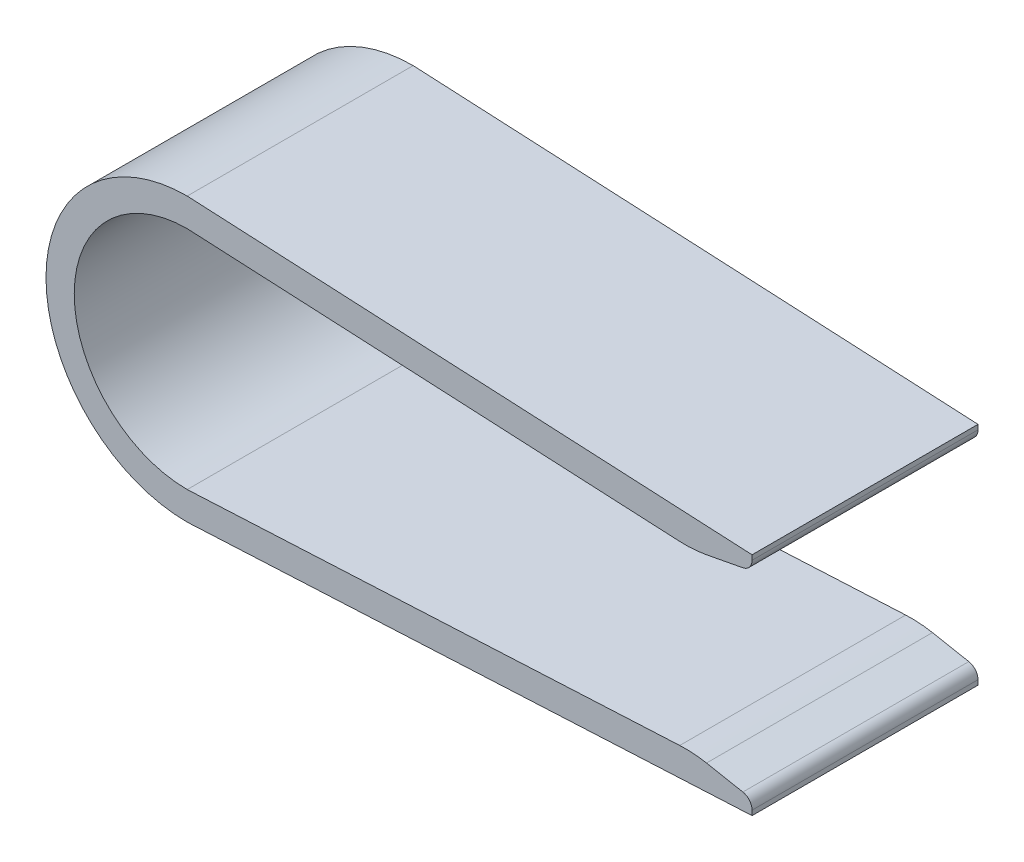
ISO-10303-21;
HEADER;
FILE_DESCRIPTION(('STEP AP214'),'2;1');
FILE_NAME('part.step','',(''),(''),'','','');
FILE_SCHEMA(('AUTOMOTIVE_DESIGN { 1 0 10303 214 1 1 1 1 }'));
ENDSEC;
DATA;
#1=APPLICATION_CONTEXT('core data for automotive mechanical design processes');
#2=APPLICATION_PROTOCOL_DEFINITION('international standard','automotive_design',2000,#1);
#3=PRODUCT_CONTEXT('',#1,'mechanical');
#4=PRODUCT('Part','Part','',(#3));
#5=PRODUCT_RELATED_PRODUCT_CATEGORY('part','',(#4));
#6=PRODUCT_DEFINITION_FORMATION('','',#4);
#7=PRODUCT_DEFINITION_CONTEXT('part definition',#1,'design');
#8=PRODUCT_DEFINITION('design','',#6,#7);
#9=PRODUCT_DEFINITION_SHAPE('','',#8);
#10=(LENGTH_UNIT() NAMED_UNIT(*) SI_UNIT(.MILLI.,.METRE.));
#11=(NAMED_UNIT(*) PLANE_ANGLE_UNIT() SI_UNIT($,.RADIAN.));
#12=(NAMED_UNIT(*) SI_UNIT($,.STERADIAN.) SOLID_ANGLE_UNIT());
#13=UNCERTAINTY_MEASURE_WITH_UNIT(LENGTH_MEASURE(1.E-05),#10,'distance_accuracy_value','');
#14=(GEOMETRIC_REPRESENTATION_CONTEXT(3) GLOBAL_UNCERTAINTY_ASSIGNED_CONTEXT((#13)) GLOBAL_UNIT_ASSIGNED_CONTEXT((#10,
#11,#12)) REPRESENTATION_CONTEXT('',''));
#15=CARTESIAN_POINT('',(0.,0.,0.));
#16=DIRECTION('',(0.,0.,1.));
#17=DIRECTION('',(1.,0.,0.));
#18=AXIS2_PLACEMENT_3D('',#15,#16,#17);
#19=CARTESIAN_POINT('',(50.,8.7500000000001,20.));
#20=DIRECTION('',(-0.186676395761627,0.982421459082327,0.));
#21=DIRECTION('',(-0.982421459082327,-0.186676395761627,0.));
#22=AXIS2_PLACEMENT_3D('',#19,#20,#21);
#23=PLANE('',#22);
#24=DIRECTION('',(0.982421459082327,0.186676395761627,0.));
#25=VECTOR('',#24,1.);
#26=CARTESIAN_POINT('',(50.,8.7500000000001,0.));
#27=LINE('',#26,#25);
#28=CARTESIAN_POINT('',(45.9653450918472,7.98334854971576,0.));
#29=VERTEX_POINT('',#28);
#30=CARTESIAN_POINT('',(49.1866763957616,8.59545500546294,0.));
#31=VERTEX_POINT('',#30);
#32=EDGE_CURVE('E175',#29,#31,#27,.T.);
#33=ORIENTED_EDGE('',*,*,#32,.T.);
#34=DIRECTION('',(0.,0.,-1.));
#35=VECTOR('',#34,1.);
#36=CARTESIAN_POINT('',(49.1866763957616,8.59545500546294,20.));
#37=LINE('',#36,#35);
#38=CARTESIAN_POINT('',(49.1866763957616,8.59545500546294,20.));
#39=VERTEX_POINT('',#38);
#40=EDGE_CURVE('E11',#31,#39,#37,.F.);
#41=ORIENTED_EDGE('',*,*,#40,.T.);
#42=DIRECTION('',(0.982421459082327,0.186676395761627,0.));
#43=VECTOR('',#42,1.);
#44=CARTESIAN_POINT('',(50.,8.7500000000001,20.));
#45=LINE('',#44,#43);
#46=CARTESIAN_POINT('',(45.9653450918472,7.98334854971576,20.));
#47=VERTEX_POINT('',#46);
#48=EDGE_CURVE('E141',#47,#39,#45,.T.);
#49=ORIENTED_EDGE('',*,*,#48,.F.);
#50=DIRECTION('',(0.,0.,-1.));
#51=VECTOR('',#50,1.);
#52=CARTESIAN_POINT('',(45.9653450918472,7.98334854971576,20.));
#53=LINE('',#52,#51);
#54=EDGE_CURVE('E222',#47,#29,#53,.T.);
#55=ORIENTED_EDGE('',*,*,#54,.T.);
#56=EDGE_LOOP('',(#33,#41,#49,#55));
#57=FACE_BOUND('',#56,.T.);
#58=ADVANCED_FACE('F33',(#57),#23,.F.);
#59=CARTESIAN_POINT('',(50.,10.,20.));
#60=DIRECTION('',(-1.,0.,0.));
#61=DIRECTION('',(0.,0.,1.));
#62=AXIS2_PLACEMENT_3D('',#59,#60,#61);
#63=PLANE('',#62);
#64=DIRECTION('',(0.,1.,0.));
#65=VECTOR('',#64,1.);
#66=CARTESIAN_POINT('',(50.,10.,20.));
#67=LINE('',#66,#65);
#68=CARTESIAN_POINT('',(50.,9.57787646454526,20.));
#69=VERTEX_POINT('',#68);
#70=CARTESIAN_POINT('',(50.,10.,20.));
#71=VERTEX_POINT('',#70);
#72=EDGE_CURVE('E131',#69,#71,#67,.T.);
#73=ORIENTED_EDGE('',*,*,#72,.F.);
#74=DIRECTION('',(0.,0.,-1.));
#75=VECTOR('',#74,1.);
#76=CARTESIAN_POINT('',(50.,9.57787646454526,20.));
#77=LINE('',#76,#75);
#78=CARTESIAN_POINT('',(50.,9.57787646454526,0.));
#79=VERTEX_POINT('',#78);
#80=EDGE_CURVE('E41',#69,#79,#77,.T.);
#81=ORIENTED_EDGE('',*,*,#80,.T.);
#82=DIRECTION('',(0.,1.,0.));
#83=VECTOR('',#82,1.);
#84=CARTESIAN_POINT('',(50.,10.,0.));
#85=LINE('',#84,#83);
#86=CARTESIAN_POINT('',(50.,10.,0.));
#87=VERTEX_POINT('',#86);
#88=EDGE_CURVE('E147',#79,#87,#85,.T.);
#89=ORIENTED_EDGE('',*,*,#88,.T.);
#90=DIRECTION('',(0.,0.,-1.));
#91=VECTOR('',#90,1.);
#92=CARTESIAN_POINT('',(50.,10.,20.));
#93=LINE('',#92,#91);
#94=EDGE_CURVE('E144',#71,#87,#93,.T.);
#95=ORIENTED_EDGE('',*,*,#94,.F.);
#96=EDGE_LOOP('',(#73,#81,#89,#95));
#97=FACE_BOUND('',#96,.T.);
#98=ADVANCED_FACE('F145',(#97),#63,.F.);
#99=CARTESIAN_POINT('',(0.,12.5,20.));
#100=DIRECTION('',(-0.0499376169438922,-0.998752338877845,0.));
#101=DIRECTION('',(0.998752338877845,-0.0499376169438923,0.));
#102=AXIS2_PLACEMENT_3D('',#99,#100,#101);
#103=PLANE('',#102);
#104=DIRECTION('',(-0.998752338877845,0.0499376169438922,0.));
#105=VECTOR('',#104,1.);
#106=CARTESIAN_POINT('',(0.,12.5,0.));
#107=LINE('',#106,#105);
#108=CARTESIAN_POINT('',(0.,12.5,0.));
#109=VERTEX_POINT('',#108);
#110=EDGE_CURVE('E178',#87,#109,#107,.T.);
#111=ORIENTED_EDGE('',*,*,#110,.T.);
#112=DIRECTION('',(0.,0.,-1.));
#113=VECTOR('',#112,1.);
#114=CARTESIAN_POINT('',(0.,12.5,20.));
#115=LINE('',#114,#113);
#116=CARTESIAN_POINT('',(0.,12.5,20.));
#117=VERTEX_POINT('',#116);
#118=EDGE_CURVE('E151',#117,#109,#115,.T.);
#119=ORIENTED_EDGE('',*,*,#118,.F.);
#120=DIRECTION('',(-0.998752338877845,0.0499376169438922,0.));
#121=VECTOR('',#120,1.);
#122=CARTESIAN_POINT('',(0.,12.5,20.));
#123=LINE('',#122,#121);
#124=EDGE_CURVE('E136',#71,#117,#123,.T.);
#125=ORIENTED_EDGE('',*,*,#124,.F.);
#126=ORIENTED_EDGE('',*,*,#94,.T.);
#127=EDGE_LOOP('',(#111,#119,#125,#126));
#128=FACE_BOUND('',#127,.T.);
#129=ADVANCED_FACE('F153',(#128),#103,.F.);
#130=CARTESIAN_POINT('',(0.,0.,20.));
#131=DIRECTION('',(0.,0.,-1.));
#132=DIRECTION('',(-1.,0.,0.));
#133=AXIS2_PLACEMENT_3D('',#130,#131,#132);
#134=CYLINDRICAL_SURFACE('',#133,12.5);
#135=CARTESIAN_POINT('',(0.,0.,0.));
#136=DIRECTION('',(0.,0.,1.));
#137=DIRECTION('',(1.,0.,0.));
#138=AXIS2_PLACEMENT_3D('',#135,#136,#137);
#139=CIRCLE('',#138,12.5);
#140=CARTESIAN_POINT('',(0.,-12.5,0.));
#141=VERTEX_POINT('',#140);
#142=EDGE_CURVE('E180',#109,#141,#139,.T.);
#143=ORIENTED_EDGE('',*,*,#142,.T.);
#144=DIRECTION('',(0.,0.,-1.));
#145=VECTOR('',#144,1.);
#146=CARTESIAN_POINT('',(0.,-12.5,20.));
#147=LINE('',#146,#145);
#148=CARTESIAN_POINT('',(0.,-12.5,20.));
#149=VERTEX_POINT('',#148);
#150=EDGE_CURVE('E204',#149,#141,#147,.T.);
#151=ORIENTED_EDGE('',*,*,#150,.F.);
#152=CARTESIAN_POINT('',(0.,0.,20.));
#153=DIRECTION('',(0.,0.,1.));
#154=DIRECTION('',(1.,0.,0.));
#155=AXIS2_PLACEMENT_3D('',#152,#153,#154);
#156=CIRCLE('',#155,12.5);
#157=EDGE_CURVE('E156',#117,#149,#156,.T.);
#158=ORIENTED_EDGE('',*,*,#157,.F.);
#159=ORIENTED_EDGE('',*,*,#118,.T.);
#160=EDGE_LOOP('',(#143,#151,#158,#159));
#161=FACE_BOUND('',#160,.T.);
#162=ADVANCED_FACE('F246',(#161),#134,.T.);
#163=CARTESIAN_POINT('',(0.,-12.5,20.));
#164=DIRECTION('',(-0.0499376169439006,0.998752338877844,0.));
#165=DIRECTION('',(-0.998752338877844,-0.0499376169439006,0.));
#166=AXIS2_PLACEMENT_3D('',#163,#164,#165);
#167=PLANE('',#166);
#168=DIRECTION('',(0.998752338877844,0.0499376169439006,0.));
#169=VECTOR('',#168,1.);
#170=CARTESIAN_POINT('',(0.,-12.5,0.));
#171=LINE('',#170,#169);
#172=CARTESIAN_POINT('',(50.,-9.99999999999958,0.));
#173=VERTEX_POINT('',#172);
#174=EDGE_CURVE('E182',#141,#173,#171,.T.);
#175=ORIENTED_EDGE('',*,*,#174,.T.);
#176=DIRECTION('',(0.,0.,-1.));
#177=VECTOR('',#176,1.);
#178=CARTESIAN_POINT('',(50.,-9.99999999999958,20.));
#179=LINE('',#178,#177);
#180=CARTESIAN_POINT('',(50.,-9.99999999999958,20.));
#181=VERTEX_POINT('',#180);
#182=EDGE_CURVE('E201',#181,#173,#179,.T.);
#183=ORIENTED_EDGE('',*,*,#182,.F.);
#184=DIRECTION('',(0.998752338877844,0.0499376169439006,0.));
#185=VECTOR('',#184,1.);
#186=CARTESIAN_POINT('',(0.,-12.5,20.));
#187=LINE('',#186,#185);
#188=EDGE_CURVE('E158',#149,#181,#187,.T.);
#189=ORIENTED_EDGE('',*,*,#188,.F.);
#190=ORIENTED_EDGE('',*,*,#150,.T.);
#191=EDGE_LOOP('',(#175,#183,#189,#190));
#192=FACE_BOUND('',#191,.T.);
#193=ADVANCED_FACE('F253',(#192),#167,.F.);
#194=CARTESIAN_POINT('',(50.,-8.74999999999969,20.));
#195=DIRECTION('',(-1.,0.,0.));
#196=DIRECTION('',(0.,0.,1.));
#197=AXIS2_PLACEMENT_3D('',#194,#195,#196);
#198=PLANE('',#197);
#199=DIRECTION('',(0.,1.,0.));
#200=VECTOR('',#199,1.);
#201=CARTESIAN_POINT('',(50.,-8.74999999999969,0.));
#202=LINE('',#201,#200);
#203=CARTESIAN_POINT('',(50.,-9.57787646454485,0.));
#204=VERTEX_POINT('',#203);
#205=EDGE_CURVE('E184',#173,#204,#202,.T.);
#206=ORIENTED_EDGE('',*,*,#205,.T.);
#207=DIRECTION('',(0.,0.,-1.));
#208=VECTOR('',#207,1.);
#209=CARTESIAN_POINT('',(50.,-9.57787646454485,20.));
#210=LINE('',#209,#208);
#211=CARTESIAN_POINT('',(50.,-9.57787646454485,20.));
#212=VERTEX_POINT('',#211);
#213=EDGE_CURVE('E234',#204,#212,#210,.F.);
#214=ORIENTED_EDGE('',*,*,#213,.T.);
#215=DIRECTION('',(0.,1.,0.));
#216=VECTOR('',#215,1.);
#217=CARTESIAN_POINT('',(50.,-8.74999999999969,20.));
#218=LINE('',#217,#216);
#219=EDGE_CURVE('E163',#181,#212,#218,.T.);
#220=ORIENTED_EDGE('',*,*,#219,.F.);
#221=ORIENTED_EDGE('',*,*,#182,.T.);
#222=EDGE_LOOP('',(#206,#214,#220,#221));
#223=FACE_BOUND('',#222,.T.);
#224=ADVANCED_FACE('F256',(#223),#198,.F.);
#225=CARTESIAN_POINT('',(44.7920271131781,-7.76039864434091,20.));
#226=DIRECTION('',(-0.186676395761619,-0.982421459082329,0.));
#227=DIRECTION('',(0.982421459082329,-0.186676395761619,0.));
#228=AXIS2_PLACEMENT_3D('',#225,#226,#227);
#229=PLANE('',#228);
#230=DIRECTION('',(-0.982421459082328,0.186676395761619,0.));
#231=VECTOR('',#230,1.);
#232=CARTESIAN_POINT('',(44.7920271131781,-7.76039864434091,20.));
#233=LINE('',#232,#231);
#234=CARTESIAN_POINT('',(49.1866763957616,-8.59545500546252,20.));
#235=VERTEX_POINT('',#234);
#236=CARTESIAN_POINT('',(45.9653450918472,-7.98334854971538,20.));
#237=VERTEX_POINT('',#236);
#238=EDGE_CURVE('E165',#235,#237,#233,.T.);
#239=ORIENTED_EDGE('',*,*,#238,.F.);
#240=DIRECTION('',(0.,0.,-1.));
#241=VECTOR('',#240,1.);
#242=CARTESIAN_POINT('',(49.1866763957616,-8.59545500546252,20.));
#243=LINE('',#242,#241);
#244=CARTESIAN_POINT('',(49.1866763957616,-8.59545500546252,0.));
#245=VERTEX_POINT('',#244);
#246=EDGE_CURVE('E227',#235,#245,#243,.T.);
#247=ORIENTED_EDGE('',*,*,#246,.T.);
#248=DIRECTION('',(-0.982421459082328,0.186676395761619,0.));
#249=VECTOR('',#248,1.);
#250=CARTESIAN_POINT('',(44.7920271131781,-7.76039864434091,0.));
#251=LINE('',#250,#249);
#252=CARTESIAN_POINT('',(45.9653450918472,-7.98334854971538,0.));
#253=VERTEX_POINT('',#252);
#254=EDGE_CURVE('E187',#245,#253,#251,.T.);
#255=ORIENTED_EDGE('',*,*,#254,.T.);
#256=DIRECTION('',(0.,0.,-1.));
#257=VECTOR('',#256,1.);
#258=CARTESIAN_POINT('',(45.9653450918472,-7.98334854971538,20.));
#259=LINE('',#258,#257);
#260=EDGE_CURVE('E215',#253,#237,#259,.F.);
#261=ORIENTED_EDGE('',*,*,#260,.T.);
#262=EDGE_LOOP('',(#239,#247,#255,#261));
#263=FACE_BOUND('',#262,.T.);
#264=ADVANCED_FACE('F263',(#263),#229,.F.);
#265=CARTESIAN_POINT('',(0.,-10.,20.));
#266=DIRECTION('',(0.0499376169438964,-0.998752338877845,0.));
#267=DIRECTION('',(0.998752338877845,0.0499376169438964,0.));
#268=AXIS2_PLACEMENT_3D('',#265,#266,#267);
#269=PLANE('',#268);
#270=DIRECTION('',(-0.998752338877844,-0.0499376169438964,0.));
#271=VECTOR('',#270,1.);
#272=CARTESIAN_POINT('',(0.,-10.,20.));
#273=LINE('',#272,#271);
#274=CARTESIAN_POINT('',(43.599204964792,-7.82003975176022,20.));
#275=VERTEX_POINT('',#274);
#276=CARTESIAN_POINT('',(0.,-10.,20.));
#277=VERTEX_POINT('',#276);
#278=EDGE_CURVE('E167',#275,#277,#273,.T.);
#279=ORIENTED_EDGE('',*,*,#278,.F.);
#280=DIRECTION('',(0.,0.,-1.));
#281=VECTOR('',#280,1.);
#282=CARTESIAN_POINT('',(43.599204964792,-7.82003975176022,20.));
#283=LINE('',#282,#281);
#284=CARTESIAN_POINT('',(43.599204964792,-7.82003975176022,0.));
#285=VERTEX_POINT('',#284);
#286=EDGE_CURVE('E150',#275,#285,#283,.T.);
#287=ORIENTED_EDGE('',*,*,#286,.T.);
#288=DIRECTION('',(-0.998752338877844,-0.0499376169438964,0.));
#289=VECTOR('',#288,1.);
#290=CARTESIAN_POINT('',(0.,-10.,0.));
#291=LINE('',#290,#289);
#292=CARTESIAN_POINT('',(0.,-10.,0.));
#293=VERTEX_POINT('',#292);
#294=EDGE_CURVE('E189',#285,#293,#291,.T.);
#295=ORIENTED_EDGE('',*,*,#294,.T.);
#296=DIRECTION('',(0.,0.,-1.));
#297=VECTOR('',#296,1.);
#298=CARTESIAN_POINT('',(0.,-10.,20.));
#299=LINE('',#298,#297);
#300=EDGE_CURVE('E198',#277,#293,#299,.T.);
#301=ORIENTED_EDGE('',*,*,#300,.F.);
#302=EDGE_LOOP('',(#279,#287,#295,#301));
#303=FACE_BOUND('',#302,.T.);
#304=ADVANCED_FACE('F272',(#303),#269,.F.);
#305=CARTESIAN_POINT('',(0.,0.,20.));
#306=DIRECTION('',(0.,0.,-1.));
#307=DIRECTION('',(-1.,0.,0.));
#308=AXIS2_PLACEMENT_3D('',#305,#306,#307);
#309=CYLINDRICAL_SURFACE('',#308,10.);
#310=CARTESIAN_POINT('',(0.,0.,0.));
#311=DIRECTION('',(0.,0.,-1.));
#312=DIRECTION('',(1.,0.,0.));
#313=AXIS2_PLACEMENT_3D('',#310,#311,#312);
#314=CIRCLE('',#313,10.);
#315=CARTESIAN_POINT('',(0.,10.,0.));
#316=VERTEX_POINT('',#315);
#317=EDGE_CURVE('E191',#293,#316,#314,.T.);
#318=ORIENTED_EDGE('',*,*,#317,.T.);
#319=DIRECTION('',(0.,0.,-1.));
#320=VECTOR('',#319,1.);
#321=CARTESIAN_POINT('',(0.,10.,20.));
#322=LINE('',#321,#320);
#323=CARTESIAN_POINT('',(0.,10.,20.));
#324=VERTEX_POINT('',#323);
#325=EDGE_CURVE('E174',#324,#316,#322,.T.);
#326=ORIENTED_EDGE('',*,*,#325,.F.);
#327=CARTESIAN_POINT('',(0.,0.,20.));
#328=DIRECTION('',(0.,0.,-1.));
#329=DIRECTION('',(1.,0.,0.));
#330=AXIS2_PLACEMENT_3D('',#327,#328,#329);
#331=CIRCLE('',#330,10.);
#332=EDGE_CURVE('E169',#277,#324,#331,.T.);
#333=ORIENTED_EDGE('',*,*,#332,.F.);
#334=ORIENTED_EDGE('',*,*,#300,.T.);
#335=EDGE_LOOP('',(#318,#326,#333,#334));
#336=FACE_BOUND('',#335,.T.);
#337=ADVANCED_FACE('F278',(#336),#309,.F.);
#338=CARTESIAN_POINT('',(0.,10.,20.));
#339=DIRECTION('',(0.0499376169438881,0.998752338877845,0.));
#340=DIRECTION('',(-0.998752338877845,0.0499376169438881,0.));
#341=AXIS2_PLACEMENT_3D('',#338,#339,#340);
#342=PLANE('',#341);
#343=DIRECTION('',(0.998752338877845,-0.0499376169438881,0.));
#344=VECTOR('',#343,1.);
#345=CARTESIAN_POINT('',(0.,10.,0.));
#346=LINE('',#345,#344);
#347=CARTESIAN_POINT('',(43.599204964792,7.82003975176058,0.));
#348=VERTEX_POINT('',#347);
#349=EDGE_CURVE('E193',#316,#348,#346,.T.);
#350=ORIENTED_EDGE('',*,*,#349,.T.);
#351=DIRECTION('',(0.,0.,-1.));
#352=VECTOR('',#351,1.);
#353=CARTESIAN_POINT('',(43.599204964792,7.82003975176058,20.));
#354=LINE('',#353,#352);
#355=CARTESIAN_POINT('',(43.599204964792,7.82003975176058,20.));
#356=VERTEX_POINT('',#355);
#357=EDGE_CURVE('E225',#348,#356,#354,.F.);
#358=ORIENTED_EDGE('',*,*,#357,.T.);
#359=DIRECTION('',(0.998752338877845,-0.0499376169438881,0.));
#360=VECTOR('',#359,1.);
#361=CARTESIAN_POINT('',(0.,10.,20.));
#362=LINE('',#361,#360);
#363=EDGE_CURVE('E171',#324,#356,#362,.T.);
#364=ORIENTED_EDGE('',*,*,#363,.F.);
#365=ORIENTED_EDGE('',*,*,#325,.T.);
#366=EDGE_LOOP('',(#350,#358,#364,#365));
#367=FACE_BOUND('',#366,.T.);
#368=ADVANCED_FACE('F287',(#367),#342,.F.);
#369=CARTESIAN_POINT('',(0.,0.,20.));
#370=DIRECTION('',(0.,0.,1.));
#371=DIRECTION('',(1.,0.,0.));
#372=AXIS2_PLACEMENT_3D('',#369,#370,#371);
#373=PLANE('',#372);
#374=ORIENTED_EDGE('',*,*,#219,.T.);
#375=CARTESIAN_POINT('',(49.,-9.57787646454485,20.));
#376=DIRECTION('',(0.,0.,1.));
#377=DIRECTION('',(1.,0.,0.));
#378=AXIS2_PLACEMENT_3D('',#375,#376,#377);
#379=CIRCLE('',#378,1.);
#380=EDGE_CURVE('E237',#212,#235,#379,.T.);
#381=ORIENTED_EDGE('',*,*,#380,.T.);
#382=ORIENTED_EDGE('',*,*,#238,.T.);
#383=CARTESIAN_POINT('',(44.098581134231,-17.8075631405387,20.));
#384=DIRECTION('',(0.,0.,1.));
#385=DIRECTION('',(1.,0.,0.));
#386=AXIS2_PLACEMENT_3D('',#383,#384,#385);
#387=CIRCLE('',#386,10.);
#388=EDGE_CURVE('E220',#237,#275,#387,.T.);
#389=ORIENTED_EDGE('',*,*,#388,.T.);
#390=ORIENTED_EDGE('',*,*,#278,.T.);
#391=ORIENTED_EDGE('',*,*,#332,.T.);
#392=ORIENTED_EDGE('',*,*,#363,.T.);
#393=CARTESIAN_POINT('',(44.0985811342309,17.807563140539,20.));
#394=DIRECTION('',(0.,0.,1.));
#395=DIRECTION('',(1.,0.,0.));
#396=AXIS2_PLACEMENT_3D('',#393,#394,#395);
#397=CIRCLE('',#396,10.);
#398=EDGE_CURVE('E218',#356,#47,#397,.T.);
#399=ORIENTED_EDGE('',*,*,#398,.T.);
#400=ORIENTED_EDGE('',*,*,#48,.T.);
#401=CARTESIAN_POINT('',(49.,9.57787646454526,20.));
#402=DIRECTION('',(0.,0.,1.));
#403=DIRECTION('',(1.,0.,0.));
#404=AXIS2_PLACEMENT_3D('',#401,#402,#403);
#405=CIRCLE('',#404,1.);
#406=EDGE_CURVE('E48',#39,#69,#405,.T.);
#407=ORIENTED_EDGE('',*,*,#406,.T.);
#408=ORIENTED_EDGE('',*,*,#72,.T.);
#409=ORIENTED_EDGE('',*,*,#124,.T.);
#410=ORIENTED_EDGE('',*,*,#157,.T.);
#411=ORIENTED_EDGE('',*,*,#188,.T.);
#412=EDGE_LOOP('',(#374,#381,#382,#389,#390,#391,#392,#399,#400,#407,#408,#409,#410,#411));
#413=FACE_BOUND('',#412,.T.);
#414=ADVANCED_FACE('F134',(#413),#373,.T.);
#415=CARTESIAN_POINT('',(0.,0.,0.));
#416=DIRECTION('',(0.,0.,1.));
#417=DIRECTION('',(1.,0.,0.));
#418=AXIS2_PLACEMENT_3D('',#415,#416,#417);
#419=PLANE('',#418);
#420=ORIENTED_EDGE('',*,*,#254,.F.);
#421=CARTESIAN_POINT('',(49.,-9.57787646454485,0.));
#422=DIRECTION('',(0.,0.,1.));
#423=DIRECTION('',(1.,0.,0.));
#424=AXIS2_PLACEMENT_3D('',#421,#422,#423);
#425=CIRCLE('',#424,1.);
#426=EDGE_CURVE('E232',#245,#204,#425,.F.);
#427=ORIENTED_EDGE('',*,*,#426,.T.);
#428=ORIENTED_EDGE('',*,*,#205,.F.);
#429=ORIENTED_EDGE('',*,*,#174,.F.);
#430=ORIENTED_EDGE('',*,*,#142,.F.);
#431=ORIENTED_EDGE('',*,*,#110,.F.);
#432=ORIENTED_EDGE('',*,*,#88,.F.);
#433=CARTESIAN_POINT('',(49.,9.57787646454526,0.));
#434=DIRECTION('',(0.,0.,1.));
#435=DIRECTION('',(1.,0.,0.));
#436=AXIS2_PLACEMENT_3D('',#433,#434,#435);
#437=CIRCLE('',#436,1.);
#438=EDGE_CURVE('E230',#79,#31,#437,.F.);
#439=ORIENTED_EDGE('',*,*,#438,.T.);
#440=ORIENTED_EDGE('',*,*,#32,.F.);
#441=CARTESIAN_POINT('',(44.0985811342309,17.807563140539,0.));
#442=DIRECTION('',(0.,0.,1.));
#443=DIRECTION('',(1.,0.,0.));
#444=AXIS2_PLACEMENT_3D('',#441,#442,#443);
#445=CIRCLE('',#444,10.);
#446=EDGE_CURVE('E210',#29,#348,#445,.F.);
#447=ORIENTED_EDGE('',*,*,#446,.T.);
#448=ORIENTED_EDGE('',*,*,#349,.F.);
#449=ORIENTED_EDGE('',*,*,#317,.F.);
#450=ORIENTED_EDGE('',*,*,#294,.F.);
#451=CARTESIAN_POINT('',(44.098581134231,-17.8075631405387,0.));
#452=DIRECTION('',(0.,0.,1.));
#453=DIRECTION('',(1.,0.,0.));
#454=AXIS2_PLACEMENT_3D('',#451,#452,#453);
#455=CIRCLE('',#454,10.);
#456=EDGE_CURVE('E212',#285,#253,#455,.F.);
#457=ORIENTED_EDGE('',*,*,#456,.T.);
#458=EDGE_LOOP('',(#420,#427,#428,#429,#430,#431,#432,#439,#440,#447,#448,#449,#450,#457));
#459=FACE_BOUND('',#458,.T.);
#460=ADVANCED_FACE('F241',(#459),#419,.F.);
#461=CARTESIAN_POINT('',(44.098581134231,-17.8075631405387,20.));
#462=DIRECTION('',(0.,0.,-1.));
#463=DIRECTION('',(-1.,0.,0.));
#464=AXIS2_PLACEMENT_3D('',#461,#462,#463);
#465=CYLINDRICAL_SURFACE('',#464,10.);
#466=ORIENTED_EDGE('',*,*,#388,.F.);
#467=ORIENTED_EDGE('',*,*,#260,.F.);
#468=ORIENTED_EDGE('',*,*,#456,.F.);
#469=ORIENTED_EDGE('',*,*,#286,.F.);
#470=EDGE_LOOP('',(#466,#467,#468,#469));
#471=FACE_BOUND('',#470,.T.);
#472=ADVANCED_FACE('F268',(#471),#465,.T.);
#473=CARTESIAN_POINT('',(44.0985811342309,17.807563140539,20.));
#474=DIRECTION('',(0.,0.,-1.));
#475=DIRECTION('',(-1.,0.,0.));
#476=AXIS2_PLACEMENT_3D('',#473,#474,#475);
#477=CYLINDRICAL_SURFACE('',#476,10.);
#478=ORIENTED_EDGE('',*,*,#398,.F.);
#479=ORIENTED_EDGE('',*,*,#357,.F.);
#480=ORIENTED_EDGE('',*,*,#446,.F.);
#481=ORIENTED_EDGE('',*,*,#54,.F.);
#482=EDGE_LOOP('',(#478,#479,#480,#481));
#483=FACE_BOUND('',#482,.T.);
#484=ADVANCED_FACE('F285',(#483),#477,.T.);
#485=CARTESIAN_POINT('',(49.,-9.57787646454485,20.));
#486=DIRECTION('',(0.,0.,-1.));
#487=DIRECTION('',(-1.,0.,0.));
#488=AXIS2_PLACEMENT_3D('',#485,#486,#487);
#489=CYLINDRICAL_SURFACE('',#488,1.);
#490=ORIENTED_EDGE('',*,*,#380,.F.);
#491=ORIENTED_EDGE('',*,*,#213,.F.);
#492=ORIENTED_EDGE('',*,*,#426,.F.);
#493=ORIENTED_EDGE('',*,*,#246,.F.);
#494=EDGE_LOOP('',(#490,#491,#492,#493));
#495=FACE_BOUND('',#494,.T.);
#496=ADVANCED_FACE('F259',(#495),#489,.T.);
#497=CARTESIAN_POINT('',(49.,9.57787646454526,20.));
#498=DIRECTION('',(0.,0.,-1.));
#499=DIRECTION('',(-1.,0.,0.));
#500=AXIS2_PLACEMENT_3D('',#497,#498,#499);
#501=CYLINDRICAL_SURFACE('',#500,1.);
#502=ORIENTED_EDGE('',*,*,#406,.F.);
#503=ORIENTED_EDGE('',*,*,#40,.F.);
#504=ORIENTED_EDGE('',*,*,#438,.F.);
#505=ORIENTED_EDGE('',*,*,#80,.F.);
#506=EDGE_LOOP('',(#502,#503,#504,#505));
#507=FACE_BOUND('',#506,.T.);
#508=ADVANCED_FACE('F35',(#507),#501,.T.);
#509=CLOSED_SHELL('',(#58,#98,#129,#162,#193,#224,#264,#304,#337,#368,#414,#460,#472,#484,#496,#508));
#510=MANIFOLD_SOLID_BREP('B2',#509);
#511=ADVANCED_BREP_SHAPE_REPRESENTATION('',(#18,#510),#14);
#512=SHAPE_DEFINITION_REPRESENTATION(#9,#511);
ENDSEC;
END-ISO-10303-21;
